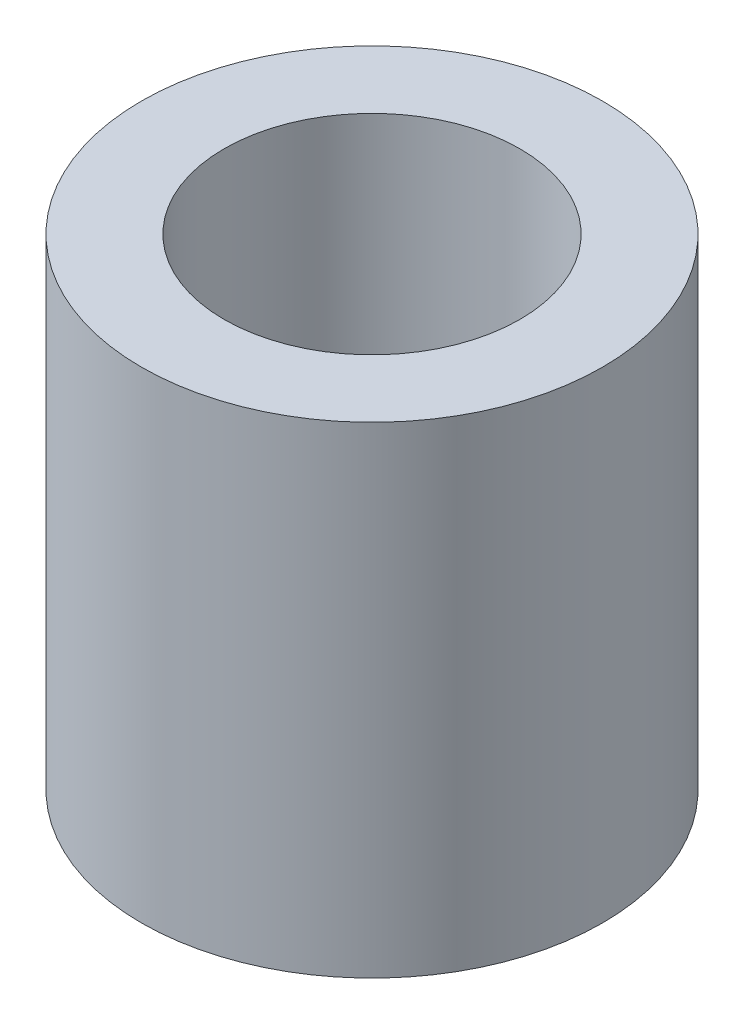
ISO-10303-21;
HEADER;
FILE_DESCRIPTION(('STEP AP214'),'2;1');
FILE_NAME('part.step','',(''),(''),'','','');
FILE_SCHEMA(('AUTOMOTIVE_DESIGN { 1 0 10303 214 1 1 1 1 }'));
ENDSEC;
DATA;
#1=APPLICATION_CONTEXT('core data for automotive mechanical design processes');
#2=APPLICATION_PROTOCOL_DEFINITION('international standard','automotive_design',2000,#1);
#3=PRODUCT_CONTEXT('',#1,'mechanical');
#4=PRODUCT('Part','Part','',(#3));
#5=PRODUCT_RELATED_PRODUCT_CATEGORY('part','',(#4));
#6=PRODUCT_DEFINITION_FORMATION('','',#4);
#7=PRODUCT_DEFINITION_CONTEXT('part definition',#1,'design');
#8=PRODUCT_DEFINITION('design','',#6,#7);
#9=PRODUCT_DEFINITION_SHAPE('','',#8);
#10=(LENGTH_UNIT() NAMED_UNIT(*) SI_UNIT(.MILLI.,.METRE.));
#11=(NAMED_UNIT(*) PLANE_ANGLE_UNIT() SI_UNIT($,.RADIAN.));
#12=(NAMED_UNIT(*) SI_UNIT($,.STERADIAN.) SOLID_ANGLE_UNIT());
#13=UNCERTAINTY_MEASURE_WITH_UNIT(LENGTH_MEASURE(1.E-05),#10,'distance_accuracy_value','');
#14=(GEOMETRIC_REPRESENTATION_CONTEXT(3) GLOBAL_UNCERTAINTY_ASSIGNED_CONTEXT((#13)) GLOBAL_UNIT_ASSIGNED_CONTEXT((#10,
#11,#12)) REPRESENTATION_CONTEXT('',''));
#15=CARTESIAN_POINT('',(0.,0.,0.));
#16=DIRECTION('',(0.,0.,1.));
#17=DIRECTION('',(1.,0.,0.));
#18=AXIS2_PLACEMENT_3D('',#15,#16,#17);
#19=CARTESIAN_POINT('',(0.,4.15,0.));
#20=DIRECTION('',(0.,1.,0.));
#21=DIRECTION('',(0.,0.,1.));
#22=AXIS2_PLACEMENT_3D('',#19,#20,#21);
#23=PLANE('',#22);
#24=CARTESIAN_POINT('',(0.,4.15,0.));
#25=DIRECTION('',(0.,1.,0.));
#26=DIRECTION('',(0.,0.,1.));
#27=AXIS2_PLACEMENT_3D('',#24,#25,#26);
#28=CIRCLE('',#27,3.975);
#29=CARTESIAN_POINT('',(0.,4.15,-3.975));
#30=VERTEX_POINT('',#29);
#31=EDGE_CURVE('E10',#30,#30,#28,.T.);
#32=ORIENTED_EDGE('',*,*,#31,.T.);
#33=EDGE_LOOP('',(#32));
#34=FACE_BOUND('',#33,.T.);
#35=CARTESIAN_POINT('',(0.,4.15,0.));
#36=DIRECTION('',(0.,1.,0.));
#37=DIRECTION('',(0.,0.,1.));
#38=AXIS2_PLACEMENT_3D('',#35,#36,#37);
#39=CIRCLE('',#38,2.55);
#40=CARTESIAN_POINT('',(0.,4.15,-2.55));
#41=VERTEX_POINT('',#40);
#42=EDGE_CURVE('E41',#41,#41,#39,.T.);
#43=ORIENTED_EDGE('',*,*,#42,.F.);
#44=EDGE_LOOP('',(#43));
#45=FACE_BOUND('',#44,.T.);
#46=ADVANCED_FACE('F30',(#34,#45),#23,.T.);
#47=CARTESIAN_POINT('',(0.,-4.15,0.));
#48=DIRECTION('',(0.,1.,0.));
#49=DIRECTION('',(0.,0.,1.));
#50=AXIS2_PLACEMENT_3D('',#47,#48,#49);
#51=PLANE('',#50);
#52=CARTESIAN_POINT('',(0.,-4.15,0.));
#53=DIRECTION('',(0.,1.,0.));
#54=DIRECTION('',(0.,0.,1.));
#55=AXIS2_PLACEMENT_3D('',#52,#53,#54);
#56=CIRCLE('',#55,3.975);
#57=CARTESIAN_POINT('',(0.,-4.15,-3.975));
#58=VERTEX_POINT('',#57);
#59=EDGE_CURVE('E34',#58,#58,#56,.T.);
#60=ORIENTED_EDGE('',*,*,#59,.F.);
#61=EDGE_LOOP('',(#60));
#62=FACE_BOUND('',#61,.T.);
#63=CARTESIAN_POINT('',(0.,-4.15,0.));
#64=DIRECTION('',(0.,1.,0.));
#65=DIRECTION('',(0.,0.,1.));
#66=AXIS2_PLACEMENT_3D('',#63,#64,#65);
#67=CIRCLE('',#66,2.55);
#68=CARTESIAN_POINT('',(0.,-4.15,-2.55));
#69=VERTEX_POINT('',#68);
#70=EDGE_CURVE('E43',#69,#69,#67,.T.);
#71=ORIENTED_EDGE('',*,*,#70,.T.);
#72=EDGE_LOOP('',(#71));
#73=FACE_BOUND('',#72,.T.);
#74=ADVANCED_FACE('F53',(#62,#73),#51,.F.);
#75=CARTESIAN_POINT('',(0.,4.15,0.));
#76=DIRECTION('',(0.,-1.,0.));
#77=DIRECTION('',(0.,0.,-1.));
#78=AXIS2_PLACEMENT_3D('',#75,#76,#77);
#79=CYLINDRICAL_SURFACE('',#78,3.975);
#80=CARTESIAN_POINT('',(0.,4.15,-3.975));
#81=CARTESIAN_POINT('',(0.,4.06354166666667,-3.975));
#82=CARTESIAN_POINT('',(0.,3.97708333333333,-3.975));
#83=CARTESIAN_POINT('',(0.,3.80416666666667,-3.975));
#84=CARTESIAN_POINT('',(0.,3.71770833333333,-3.975));
#85=CARTESIAN_POINT('',(0.,3.54479166666667,-3.975));
#86=CARTESIAN_POINT('',(0.,3.45833333333333,-3.975));
#87=CARTESIAN_POINT('',(0.,3.28541666666667,-3.975));
#88=CARTESIAN_POINT('',(0.,3.19895833333333,-3.975));
#89=CARTESIAN_POINT('',(0.,3.02604166666667,-3.975));
#90=CARTESIAN_POINT('',(0.,2.93958333333333,-3.975));
#91=CARTESIAN_POINT('',(0.,2.76666666666667,-3.975));
#92=CARTESIAN_POINT('',(0.,2.68020833333333,-3.975));
#93=CARTESIAN_POINT('',(0.,2.50729166666667,-3.975));
#94=CARTESIAN_POINT('',(0.,2.42083333333333,-3.975));
#95=CARTESIAN_POINT('',(0.,2.24791666666667,-3.975));
#96=CARTESIAN_POINT('',(0.,2.16145833333333,-3.975));
#97=CARTESIAN_POINT('',(0.,1.98854166666667,-3.975));
#98=CARTESIAN_POINT('',(0.,1.90208333333333,-3.975));
#99=CARTESIAN_POINT('',(0.,1.72916666666667,-3.975));
#100=CARTESIAN_POINT('',(0.,1.64270833333333,-3.975));
#101=CARTESIAN_POINT('',(0.,1.46979166666667,-3.975));
#102=CARTESIAN_POINT('',(0.,1.38333333333333,-3.975));
#103=CARTESIAN_POINT('',(0.,1.21041666666667,-3.975));
#104=CARTESIAN_POINT('',(0.,1.12395833333333,-3.975));
#105=CARTESIAN_POINT('',(0.,0.951041666666666,-3.975));
#106=CARTESIAN_POINT('',(0.,0.864583333333333,-3.975));
#107=CARTESIAN_POINT('',(0.,0.691666666666666,-3.975));
#108=CARTESIAN_POINT('',(0.,0.605208333333333,-3.975));
#109=CARTESIAN_POINT('',(0.,0.432291666666666,-3.975));
#110=CARTESIAN_POINT('',(0.,0.345833333333333,-3.975));
#111=CARTESIAN_POINT('',(0.,0.172916666666666,-3.975));
#112=CARTESIAN_POINT('',(0.,0.0864583333333331,-3.975));
#113=CARTESIAN_POINT('',(0.,-0.0864583333333333,-3.975));
#114=CARTESIAN_POINT('',(0.,-0.172916666666667,-3.975));
#115=CARTESIAN_POINT('',(0.,-0.345833333333333,-3.975));
#116=CARTESIAN_POINT('',(0.,-0.432291666666667,-3.975));
#117=CARTESIAN_POINT('',(0.,-0.605208333333333,-3.975));
#118=CARTESIAN_POINT('',(0.,-0.691666666666667,-3.975));
#119=CARTESIAN_POINT('',(0.,-0.864583333333333,-3.975));
#120=CARTESIAN_POINT('',(0.,-0.951041666666667,-3.975));
#121=CARTESIAN_POINT('',(0.,-1.12395833333333,-3.975));
#122=CARTESIAN_POINT('',(0.,-1.21041666666667,-3.975));
#123=CARTESIAN_POINT('',(0.,-1.38333333333333,-3.975));
#124=CARTESIAN_POINT('',(0.,-1.46979166666667,-3.975));
#125=CARTESIAN_POINT('',(0.,-1.64270833333333,-3.975));
#126=CARTESIAN_POINT('',(0.,-1.72916666666667,-3.975));
#127=CARTESIAN_POINT('',(0.,-1.90208333333333,-3.975));
#128=CARTESIAN_POINT('',(0.,-1.98854166666667,-3.975));
#129=CARTESIAN_POINT('',(0.,-2.16145833333333,-3.975));
#130=CARTESIAN_POINT('',(0.,-2.24791666666667,-3.975));
#131=CARTESIAN_POINT('',(0.,-2.42083333333333,-3.975));
#132=CARTESIAN_POINT('',(0.,-2.50729166666667,-3.975));
#133=CARTESIAN_POINT('',(0.,-2.68020833333333,-3.975));
#134=CARTESIAN_POINT('',(0.,-2.76666666666667,-3.975));
#135=CARTESIAN_POINT('',(0.,-2.93958333333333,-3.975));
#136=CARTESIAN_POINT('',(0.,-3.02604166666667,-3.975));
#137=CARTESIAN_POINT('',(0.,-3.19895833333333,-3.975));
#138=CARTESIAN_POINT('',(0.,-3.28541666666667,-3.975));
#139=CARTESIAN_POINT('',(0.,-3.45833333333333,-3.975));
#140=CARTESIAN_POINT('',(0.,-3.54479166666667,-3.975));
#141=CARTESIAN_POINT('',(0.,-3.71770833333333,-3.975));
#142=CARTESIAN_POINT('',(0.,-3.80416666666667,-3.975));
#143=CARTESIAN_POINT('',(0.,-3.97708333333333,-3.975));
#144=CARTESIAN_POINT('',(0.,-4.06354166666667,-3.975));
#145=CARTESIAN_POINT('',(0.,-4.15,-3.975));
#146=B_SPLINE_CURVE_WITH_KNOTS('',3,(#80,#81,#82,#83,#84,#85,#86,#87,#88,#89,#90,#91,#92,#93,
#94,#95,#96,#97,#98,#99,#100,#101,#102,#103,#104,#105,#106,#107,#108,#109,#110,#111,#112,#113,
#114,#115,#116,#117,#118,#119,#120,#121,#122,#123,#124,#125,#126,#127,#128,#129,#130,#131,#132,
#133,#134,#135,#136,#137,#138,#139,#140,#141,#142,#143,#144,#145),.UNSPECIFIED.,.F.,.F.,(4,2,2,
2,2,2,2,2,2,2,2,2,2,2,2,2,2,2,2,2,2,2,2,2,2,2,2,2,2,2,2,2,4),(0.,0.259375,0.518750000000001,
0.778125000000001,1.0375,1.296875,1.55625,1.815625,2.075,2.334375,2.59375,2.853125,3.1125,
3.371875,3.63125,3.890625,4.15,4.409375,4.66875,4.928125,5.1875,5.446875,5.70625,5.965625,6.225,
6.484375,6.74375,7.003125,7.2625,7.521875,7.78125,8.040625,8.3),.UNSPECIFIED.);
#147=EDGE_CURVE('BSEAM32',#30,#58,#146,.T.);
#148=ORIENTED_EDGE('',*,*,#31,.F.);
#149=ORIENTED_EDGE('',*,*,#59,.T.);
#150=ORIENTED_EDGE('',*,*,#147,.T.);
#151=ORIENTED_EDGE('',*,*,#147,.F.);
#152=EDGE_LOOP('',(#148,#150,#149,#151));
#153=FACE_BOUND('',#152,.T.);
#154=ADVANCED_FACE('F32',(#153),#79,.T.);
#155=CARTESIAN_POINT('',(0.,4.15,0.));
#156=DIRECTION('',(0.,-1.,0.));
#157=DIRECTION('',(0.,0.,-1.));
#158=AXIS2_PLACEMENT_3D('',#155,#156,#157);
#159=CYLINDRICAL_SURFACE('',#158,2.55);
#160=CARTESIAN_POINT('',(0.,4.15,-2.55));
#161=CARTESIAN_POINT('',(0.,4.06354166666667,-2.55));
#162=CARTESIAN_POINT('',(0.,3.97708333333333,-2.55));
#163=CARTESIAN_POINT('',(0.,3.80416666666667,-2.55));
#164=CARTESIAN_POINT('',(0.,3.71770833333333,-2.55));
#165=CARTESIAN_POINT('',(0.,3.54479166666667,-2.55));
#166=CARTESIAN_POINT('',(0.,3.45833333333333,-2.55));
#167=CARTESIAN_POINT('',(0.,3.28541666666667,-2.55));
#168=CARTESIAN_POINT('',(0.,3.19895833333333,-2.55));
#169=CARTESIAN_POINT('',(0.,3.02604166666667,-2.55));
#170=CARTESIAN_POINT('',(0.,2.93958333333333,-2.55));
#171=CARTESIAN_POINT('',(0.,2.76666666666667,-2.55));
#172=CARTESIAN_POINT('',(0.,2.68020833333333,-2.55));
#173=CARTESIAN_POINT('',(0.,2.50729166666667,-2.55));
#174=CARTESIAN_POINT('',(0.,2.42083333333333,-2.55));
#175=CARTESIAN_POINT('',(0.,2.24791666666667,-2.55));
#176=CARTESIAN_POINT('',(0.,2.16145833333333,-2.55));
#177=CARTESIAN_POINT('',(0.,1.98854166666667,-2.55));
#178=CARTESIAN_POINT('',(0.,1.90208333333333,-2.55));
#179=CARTESIAN_POINT('',(0.,1.72916666666667,-2.55));
#180=CARTESIAN_POINT('',(0.,1.64270833333333,-2.55));
#181=CARTESIAN_POINT('',(0.,1.46979166666667,-2.55));
#182=CARTESIAN_POINT('',(0.,1.38333333333333,-2.55));
#183=CARTESIAN_POINT('',(0.,1.21041666666667,-2.55));
#184=CARTESIAN_POINT('',(0.,1.12395833333333,-2.55));
#185=CARTESIAN_POINT('',(0.,0.951041666666666,-2.55));
#186=CARTESIAN_POINT('',(0.,0.864583333333333,-2.55));
#187=CARTESIAN_POINT('',(0.,0.691666666666666,-2.55));
#188=CARTESIAN_POINT('',(0.,0.605208333333333,-2.55));
#189=CARTESIAN_POINT('',(0.,0.432291666666666,-2.55));
#190=CARTESIAN_POINT('',(0.,0.345833333333333,-2.55));
#191=CARTESIAN_POINT('',(0.,0.172916666666666,-2.55));
#192=CARTESIAN_POINT('',(0.,0.0864583333333331,-2.55));
#193=CARTESIAN_POINT('',(0.,-0.0864583333333333,-2.55));
#194=CARTESIAN_POINT('',(0.,-0.172916666666667,-2.55));
#195=CARTESIAN_POINT('',(0.,-0.345833333333333,-2.55));
#196=CARTESIAN_POINT('',(0.,-0.432291666666667,-2.55));
#197=CARTESIAN_POINT('',(0.,-0.605208333333333,-2.55));
#198=CARTESIAN_POINT('',(0.,-0.691666666666667,-2.55));
#199=CARTESIAN_POINT('',(0.,-0.864583333333333,-2.55));
#200=CARTESIAN_POINT('',(0.,-0.951041666666667,-2.55));
#201=CARTESIAN_POINT('',(0.,-1.12395833333333,-2.55));
#202=CARTESIAN_POINT('',(0.,-1.21041666666667,-2.55));
#203=CARTESIAN_POINT('',(0.,-1.38333333333333,-2.55));
#204=CARTESIAN_POINT('',(0.,-1.46979166666667,-2.55));
#205=CARTESIAN_POINT('',(0.,-1.64270833333333,-2.55));
#206=CARTESIAN_POINT('',(0.,-1.72916666666667,-2.55));
#207=CARTESIAN_POINT('',(0.,-1.90208333333333,-2.55));
#208=CARTESIAN_POINT('',(0.,-1.98854166666667,-2.55));
#209=CARTESIAN_POINT('',(0.,-2.16145833333333,-2.55));
#210=CARTESIAN_POINT('',(0.,-2.24791666666667,-2.55));
#211=CARTESIAN_POINT('',(0.,-2.42083333333333,-2.55));
#212=CARTESIAN_POINT('',(0.,-2.50729166666667,-2.55));
#213=CARTESIAN_POINT('',(0.,-2.68020833333333,-2.55));
#214=CARTESIAN_POINT('',(0.,-2.76666666666667,-2.55));
#215=CARTESIAN_POINT('',(0.,-2.93958333333333,-2.55));
#216=CARTESIAN_POINT('',(0.,-3.02604166666667,-2.55));
#217=CARTESIAN_POINT('',(0.,-3.19895833333333,-2.55));
#218=CARTESIAN_POINT('',(0.,-3.28541666666667,-2.55));
#219=CARTESIAN_POINT('',(0.,-3.45833333333333,-2.55));
#220=CARTESIAN_POINT('',(0.,-3.54479166666667,-2.55));
#221=CARTESIAN_POINT('',(0.,-3.71770833333333,-2.55));
#222=CARTESIAN_POINT('',(0.,-3.80416666666667,-2.55));
#223=CARTESIAN_POINT('',(0.,-3.97708333333333,-2.55));
#224=CARTESIAN_POINT('',(0.,-4.06354166666667,-2.55));
#225=CARTESIAN_POINT('',(0.,-4.15,-2.55));
#226=B_SPLINE_CURVE_WITH_KNOTS('',3,(#160,#161,#162,#163,#164,#165,#166,#167,#168,#169,#170,
#171,#172,#173,#174,#175,#176,#177,#178,#179,#180,#181,#182,#183,#184,#185,#186,#187,#188,#189,
#190,#191,#192,#193,#194,#195,#196,#197,#198,#199,#200,#201,#202,#203,#204,#205,#206,#207,#208,
#209,#210,#211,#212,#213,#214,#215,#216,#217,#218,#219,#220,#221,#222,#223,#224,#225),
.UNSPECIFIED.,.F.,.F.,(4,2,2,2,2,2,2,2,2,2,2,2,2,2,2,2,2,2,2,2,2,2,2,2,2,2,2,2,2,2,2,2,4),(0.,
0.259375,0.518750000000001,0.778125000000001,1.0375,1.296875,1.55625,1.815625,2.075,2.334375,
2.59375,2.853125,3.1125,3.371875,3.63125,3.890625,4.15,4.409375,4.66875,4.928125,5.1875,
5.446875,5.70625,5.965625,6.225,6.484375,6.74375,7.003125,7.2625,7.521875,7.78125,8.040625,8.3),.UNSPECIFIED.);
#227=EDGE_CURVE('BSEAM49',#41,#69,#226,.T.);
#228=ORIENTED_EDGE('',*,*,#42,.T.);
#229=ORIENTED_EDGE('',*,*,#70,.F.);
#230=ORIENTED_EDGE('',*,*,#227,.T.);
#231=ORIENTED_EDGE('',*,*,#227,.F.);
#232=EDGE_LOOP('',(#228,#230,#229,#231));
#233=FACE_BOUND('',#232,.T.);
#234=ADVANCED_FACE('F49',(#233),#159,.F.);
#235=CLOSED_SHELL('',(#46,#74,#154,#234));
#236=MANIFOLD_SOLID_BREP('B2',#235);
#237=ADVANCED_BREP_SHAPE_REPRESENTATION('',(#18,#236),#14);
#238=SHAPE_DEFINITION_REPRESENTATION(#9,#237);
ENDSEC;
END-ISO-10303-21;
